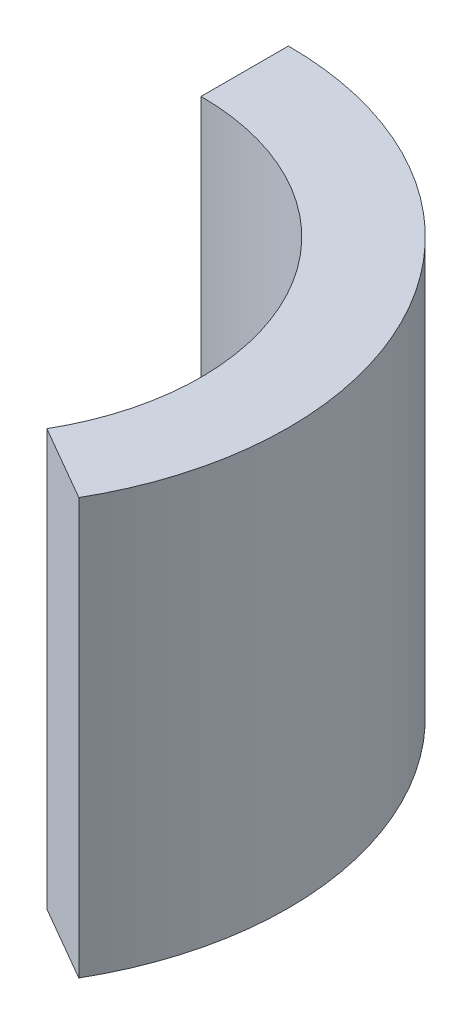
ISO-10303-21;
HEADER;
FILE_DESCRIPTION(('STEP AP214'),'2;1');
FILE_NAME('part.step','',(''),(''),'','','');
FILE_SCHEMA(('AUTOMOTIVE_DESIGN { 1 0 10303 214 1 1 1 1 }'));
ENDSEC;
DATA;
#1=APPLICATION_CONTEXT('core data for automotive mechanical design processes');
#2=APPLICATION_PROTOCOL_DEFINITION('international standard','automotive_design',2000,#1);
#3=PRODUCT_CONTEXT('',#1,'mechanical');
#4=PRODUCT('Part','Part','',(#3));
#5=PRODUCT_RELATED_PRODUCT_CATEGORY('part','',(#4));
#6=PRODUCT_DEFINITION_FORMATION('','',#4);
#7=PRODUCT_DEFINITION_CONTEXT('part definition',#1,'design');
#8=PRODUCT_DEFINITION('design','',#6,#7);
#9=PRODUCT_DEFINITION_SHAPE('','',#8);
#10=(LENGTH_UNIT() NAMED_UNIT(*) SI_UNIT(.MILLI.,.METRE.));
#11=(NAMED_UNIT(*) PLANE_ANGLE_UNIT() SI_UNIT($,.RADIAN.));
#12=(NAMED_UNIT(*) SI_UNIT($,.STERADIAN.) SOLID_ANGLE_UNIT());
#13=UNCERTAINTY_MEASURE_WITH_UNIT(LENGTH_MEASURE(1.E-05),#10,'distance_accuracy_value','');
#14=(GEOMETRIC_REPRESENTATION_CONTEXT(3) GLOBAL_UNCERTAINTY_ASSIGNED_CONTEXT((#13)) GLOBAL_UNIT_ASSIGNED_CONTEXT((#10,
#11,#12)) REPRESENTATION_CONTEXT('',''));
#15=CARTESIAN_POINT('',(0.,0.,0.));
#16=DIRECTION('',(0.,0.,1.));
#17=DIRECTION('',(1.,0.,0.));
#18=AXIS2_PLACEMENT_3D('',#15,#16,#17);
#19=CARTESIAN_POINT('',(0.,19.05,0.));
#20=DIRECTION('',(0.,-1.,0.));
#21=DIRECTION('',(0.,0.,-1.));
#22=AXIS2_PLACEMENT_3D('',#19,#20,#21);
#23=CYLINDRICAL_SURFACE('',#22,11.135);
#24=CARTESIAN_POINT('',(0.,0.,0.));
#25=DIRECTION('',(0.,1.,0.));
#26=DIRECTION('',(0.,0.,1.));
#27=AXIS2_PLACEMENT_3D('',#24,#25,#26);
#28=CIRCLE('',#27,11.135);
#29=CARTESIAN_POINT('',(9.64319287113974,0.,5.56749999999997));
#30=VERTEX_POINT('',#29);
#31=CARTESIAN_POINT('',(0.,0.,-11.135));
#32=VERTEX_POINT('',#31);
#33=EDGE_CURVE('E108',#30,#32,#28,.T.);
#34=ORIENTED_EDGE('',*,*,#33,.F.);
#35=DIRECTION('',(0.,-1.,0.));
#36=VECTOR('',#35,1.);
#37=CARTESIAN_POINT('',(9.64319287113974,19.05,5.56749999999997));
#38=LINE('',#37,#36);
#39=CARTESIAN_POINT('',(9.64319287113974,19.05,5.56749999999997));
#40=VERTEX_POINT('',#39);
#41=EDGE_CURVE('E11',#40,#30,#38,.T.);
#42=ORIENTED_EDGE('',*,*,#41,.F.);
#43=CARTESIAN_POINT('',(0.,19.05,0.));
#44=DIRECTION('',(0.,1.,0.));
#45=DIRECTION('',(0.,0.,1.));
#46=AXIS2_PLACEMENT_3D('',#43,#44,#45);
#47=CIRCLE('',#46,11.135);
#48=CARTESIAN_POINT('',(0.,19.05,-11.135));
#49=VERTEX_POINT('',#48);
#50=EDGE_CURVE('E92',#40,#49,#47,.T.);
#51=ORIENTED_EDGE('',*,*,#50,.T.);
#52=DIRECTION('',(0.,-1.,0.));
#53=VECTOR('',#52,1.);
#54=CARTESIAN_POINT('',(0.,19.05,-11.135));
#55=LINE('',#54,#53);
#56=EDGE_CURVE('E81',#49,#32,#55,.T.);
#57=ORIENTED_EDGE('',*,*,#56,.T.);
#58=EDGE_LOOP('',(#34,#42,#51,#57));
#59=FACE_BOUND('',#58,.T.);
#60=ADVANCED_FACE('F41',(#59),#23,.F.);
#61=CARTESIAN_POINT('',(0.,19.05,0.));
#62=DIRECTION('',(0.499999999999998,0.,-0.86602540378444));
#63=DIRECTION('',(-0.86602540378444,0.,-0.499999999999998));
#64=AXIS2_PLACEMENT_3D('',#61,#62,#63);
#65=PLANE('',#64);
#66=DIRECTION('',(0.86602540378444,0.,0.499999999999998));
#67=VECTOR('',#66,1.);
#68=CARTESIAN_POINT('',(0.,0.,0.));
#69=LINE('',#68,#67);
#70=CARTESIAN_POINT('',(13.1072944862775,0.,7.56749999999996));
#71=VERTEX_POINT('',#70);
#72=EDGE_CURVE('E98',#30,#71,#69,.T.);
#73=ORIENTED_EDGE('',*,*,#72,.T.);
#74=DIRECTION('',(0.,-1.,0.));
#75=VECTOR('',#74,1.);
#76=CARTESIAN_POINT('',(13.1072944862775,19.05,7.56749999999996));
#77=LINE('',#76,#75);
#78=CARTESIAN_POINT('',(13.1072944862775,19.05,7.56749999999996));
#79=VERTEX_POINT('',#78);
#80=EDGE_CURVE('E50',#79,#71,#77,.T.);
#81=ORIENTED_EDGE('',*,*,#80,.F.);
#82=DIRECTION('',(0.86602540378444,0.,0.499999999999998));
#83=VECTOR('',#82,1.);
#84=CARTESIAN_POINT('',(0.,19.05,0.));
#85=LINE('',#84,#83);
#86=EDGE_CURVE('E87',#40,#79,#85,.T.);
#87=ORIENTED_EDGE('',*,*,#86,.F.);
#88=ORIENTED_EDGE('',*,*,#41,.T.);
#89=EDGE_LOOP('',(#73,#81,#87,#88));
#90=FACE_BOUND('',#89,.T.);
#91=ADVANCED_FACE('F96',(#90),#65,.F.);
#92=CARTESIAN_POINT('',(0.,19.05,0.));
#93=DIRECTION('',(0.,-1.,0.));
#94=DIRECTION('',(0.,0.,-1.));
#95=AXIS2_PLACEMENT_3D('',#92,#93,#94);
#96=CYLINDRICAL_SURFACE('',#95,15.135);
#97=CARTESIAN_POINT('',(0.,0.,0.));
#98=DIRECTION('',(0.,1.,0.));
#99=DIRECTION('',(0.,0.,1.));
#100=AXIS2_PLACEMENT_3D('',#97,#98,#99);
#101=CIRCLE('',#100,15.135);
#102=CARTESIAN_POINT('',(0.,0.,-15.135));
#103=VERTEX_POINT('',#102);
#104=EDGE_CURVE('E74',#71,#103,#101,.T.);
#105=ORIENTED_EDGE('',*,*,#104,.T.);
#106=DIRECTION('',(0.,-1.,0.));
#107=VECTOR('',#106,1.);
#108=CARTESIAN_POINT('',(0.,19.05,-15.135));
#109=LINE('',#108,#107);
#110=CARTESIAN_POINT('',(0.,19.05,-15.135));
#111=VERTEX_POINT('',#110);
#112=EDGE_CURVE('E100',#111,#103,#109,.T.);
#113=ORIENTED_EDGE('',*,*,#112,.F.);
#114=CARTESIAN_POINT('',(0.,19.05,0.));
#115=DIRECTION('',(0.,1.,0.));
#116=DIRECTION('',(0.,0.,1.));
#117=AXIS2_PLACEMENT_3D('',#114,#115,#116);
#118=CIRCLE('',#117,15.135);
#119=EDGE_CURVE('E91',#79,#111,#118,.T.);
#120=ORIENTED_EDGE('',*,*,#119,.F.);
#121=ORIENTED_EDGE('',*,*,#80,.T.);
#122=EDGE_LOOP('',(#105,#113,#120,#121));
#123=FACE_BOUND('',#122,.T.);
#124=ADVANCED_FACE('F101',(#123),#96,.T.);
#125=CARTESIAN_POINT('',(0.,19.05,0.));
#126=DIRECTION('',(1.,0.,0.));
#127=DIRECTION('',(0.,0.,-1.));
#128=AXIS2_PLACEMENT_3D('',#125,#126,#127);
#129=PLANE('',#128);
#130=DIRECTION('',(0.,0.,1.));
#131=VECTOR('',#130,1.);
#132=CARTESIAN_POINT('',(0.,0.,0.));
#133=LINE('',#132,#131);
#134=EDGE_CURVE('E116',#103,#32,#133,.T.);
#135=ORIENTED_EDGE('',*,*,#134,.T.);
#136=ORIENTED_EDGE('',*,*,#56,.F.);
#137=DIRECTION('',(0.,0.,1.));
#138=VECTOR('',#137,1.);
#139=CARTESIAN_POINT('',(0.,19.05,0.));
#140=LINE('',#139,#138);
#141=EDGE_CURVE('E58',#111,#49,#140,.T.);
#142=ORIENTED_EDGE('',*,*,#141,.F.);
#143=ORIENTED_EDGE('',*,*,#112,.T.);
#144=EDGE_LOOP('',(#135,#136,#142,#143));
#145=FACE_BOUND('',#144,.T.);
#146=ADVANCED_FACE('F124',(#145),#129,.F.);
#147=CARTESIAN_POINT('',(0.,19.05,0.));
#148=DIRECTION('',(0.,1.,0.));
#149=DIRECTION('',(0.,0.,1.));
#150=AXIS2_PLACEMENT_3D('',#147,#148,#149);
#151=PLANE('',#150);
#152=ORIENTED_EDGE('',*,*,#50,.F.);
#153=ORIENTED_EDGE('',*,*,#86,.T.);
#154=ORIENTED_EDGE('',*,*,#119,.T.);
#155=ORIENTED_EDGE('',*,*,#141,.T.);
#156=EDGE_LOOP('',(#152,#153,#154,#155));
#157=FACE_BOUND('',#156,.T.);
#158=ADVANCED_FACE('F89',(#157),#151,.T.);
#159=CARTESIAN_POINT('',(0.,0.,0.));
#160=DIRECTION('',(0.,1.,0.));
#161=DIRECTION('',(0.,0.,1.));
#162=AXIS2_PLACEMENT_3D('',#159,#160,#161);
#163=PLANE('',#162);
#164=ORIENTED_EDGE('',*,*,#33,.T.);
#165=ORIENTED_EDGE('',*,*,#134,.F.);
#166=ORIENTED_EDGE('',*,*,#104,.F.);
#167=ORIENTED_EDGE('',*,*,#72,.F.);
#168=EDGE_LOOP('',(#164,#165,#166,#167));
#169=FACE_BOUND('',#168,.T.);
#170=ADVANCED_FACE('F126',(#169),#163,.F.);
#171=CLOSED_SHELL('',(#60,#91,#124,#146,#158,#170));
#172=MANIFOLD_SOLID_BREP('B2',#171);
#173=ADVANCED_BREP_SHAPE_REPRESENTATION('',(#18,#172),#14);
#174=SHAPE_DEFINITION_REPRESENTATION(#9,#173);
ENDSEC;
END-ISO-10303-21;
